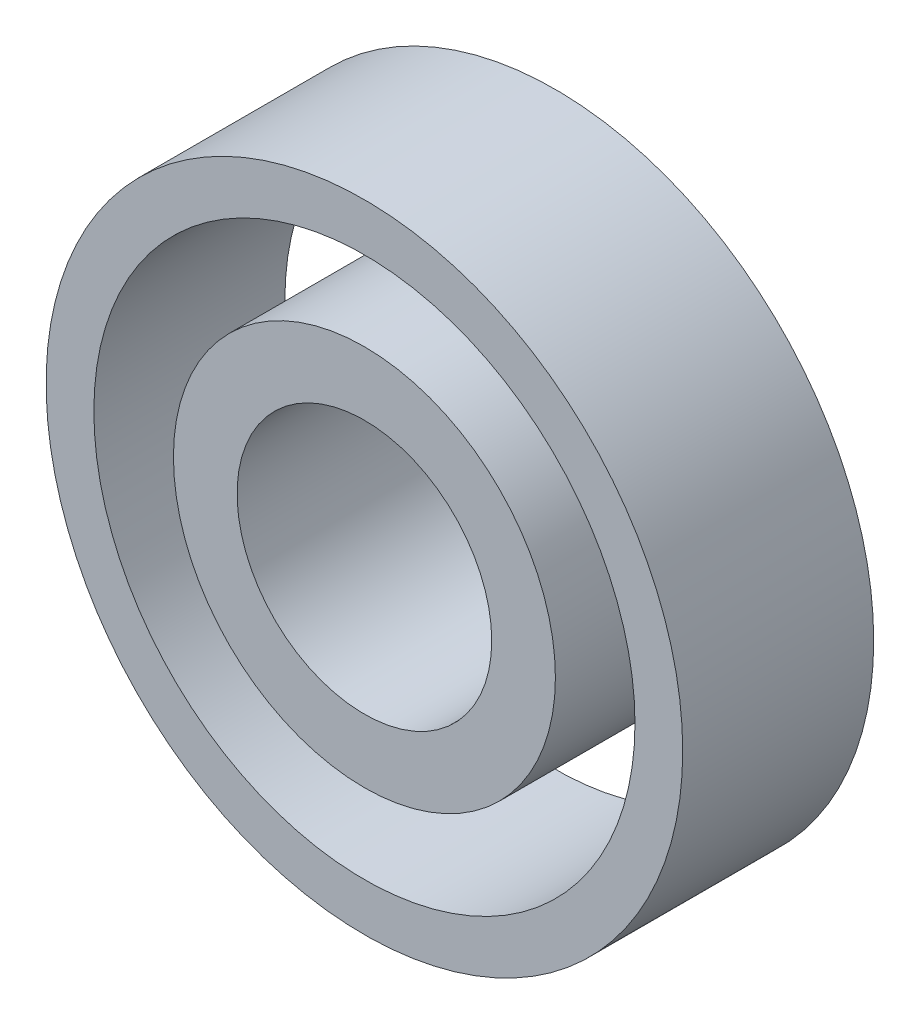
ISO-10303-21;
HEADER;
FILE_DESCRIPTION(('STEP AP214'),'2;1');
FILE_NAME('part.step','',(''),(''),'','','');
FILE_SCHEMA(('AUTOMOTIVE_DESIGN { 1 0 10303 214 1 1 1 1 }'));
ENDSEC;
DATA;
#1=APPLICATION_CONTEXT('core data for automotive mechanical design processes');
#2=APPLICATION_PROTOCOL_DEFINITION('international standard','automotive_design',2000,#1);
#3=PRODUCT_CONTEXT('',#1,'mechanical');
#4=PRODUCT('Part','Part','',(#3));
#5=PRODUCT_RELATED_PRODUCT_CATEGORY('part','',(#4));
#6=PRODUCT_DEFINITION_FORMATION('','',#4);
#7=PRODUCT_DEFINITION_CONTEXT('part definition',#1,'design');
#8=PRODUCT_DEFINITION('design','',#6,#7);
#9=PRODUCT_DEFINITION_SHAPE('','',#8);
#10=(LENGTH_UNIT() NAMED_UNIT(*) SI_UNIT(.MILLI.,.METRE.));
#11=(NAMED_UNIT(*) PLANE_ANGLE_UNIT() SI_UNIT($,.RADIAN.));
#12=(NAMED_UNIT(*) SI_UNIT($,.STERADIAN.) SOLID_ANGLE_UNIT());
#13=UNCERTAINTY_MEASURE_WITH_UNIT(LENGTH_MEASURE(1.E-05),#10,'distance_accuracy_value','');
#14=(GEOMETRIC_REPRESENTATION_CONTEXT(3) GLOBAL_UNCERTAINTY_ASSIGNED_CONTEXT((#13)) GLOBAL_UNIT_ASSIGNED_CONTEXT((#10,
#11,#12)) REPRESENTATION_CONTEXT('',''));
#15=CARTESIAN_POINT('',(0.,0.,0.));
#16=DIRECTION('',(0.,0.,1.));
#17=DIRECTION('',(1.,0.,0.));
#18=AXIS2_PLACEMENT_3D('',#15,#16,#17);
#19=CARTESIAN_POINT('',(0.,0.,-12.));
#20=DIRECTION('',(0.,0.,1.));
#21=DIRECTION('',(1.,0.,0.));
#22=AXIS2_PLACEMENT_3D('',#19,#20,#21);
#23=CYLINDRICAL_SURFACE('',#22,12.);
#24=CARTESIAN_POINT('',(0.,0.,-12.));
#25=DIRECTION('',(0.,0.,1.));
#26=DIRECTION('',(1.,0.,0.));
#27=AXIS2_PLACEMENT_3D('',#24,#25,#26);
#28=CIRCLE('',#27,12.);
#29=CARTESIAN_POINT('',(12.,0.,-12.));
#30=VERTEX_POINT('',#29);
#31=EDGE_CURVE('E11',#30,#30,#28,.T.);
#32=ORIENTED_EDGE('',*,*,#31,.T.);
#33=EDGE_LOOP('',(#32));
#34=FACE_BOUND('',#33,.T.);
#35=CARTESIAN_POINT('',(0.,0.,0.));
#36=DIRECTION('',(0.,0.,1.));
#37=DIRECTION('',(1.,0.,0.));
#38=AXIS2_PLACEMENT_3D('',#35,#36,#37);
#39=CIRCLE('',#38,12.);
#40=CARTESIAN_POINT('',(12.,0.,0.));
#41=VERTEX_POINT('',#40);
#42=EDGE_CURVE('E52',#41,#41,#39,.T.);
#43=ORIENTED_EDGE('',*,*,#42,.F.);
#44=EDGE_LOOP('',(#43));
#45=FACE_BOUND('',#44,.T.);
#46=ADVANCED_FACE('F49',(#34,#45),#23,.T.);
#47=CARTESIAN_POINT('',(0.,0.,-12.));
#48=DIRECTION('',(0.,0.,1.));
#49=DIRECTION('',(1.,0.,0.));
#50=AXIS2_PLACEMENT_3D('',#47,#48,#49);
#51=PLANE('',#50);
#52=CARTESIAN_POINT('',(0.,0.,-12.));
#53=DIRECTION('',(0.,0.,1.));
#54=DIRECTION('',(1.,0.,0.));
#55=AXIS2_PLACEMENT_3D('',#52,#53,#54);
#56=CIRCLE('',#55,8.);
#57=CARTESIAN_POINT('',(8.,0.,-12.));
#58=VERTEX_POINT('',#57);
#59=EDGE_CURVE('E59',#58,#58,#56,.T.);
#60=ORIENTED_EDGE('',*,*,#59,.T.);
#61=EDGE_LOOP('',(#60));
#62=FACE_BOUND('',#61,.T.);
#63=ORIENTED_EDGE('',*,*,#31,.F.);
#64=EDGE_LOOP('',(#63));
#65=FACE_BOUND('',#64,.T.);
#66=ADVANCED_FACE('F67',(#62,#65),#51,.F.);
#67=CARTESIAN_POINT('',(0.,0.,0.));
#68=DIRECTION('',(0.,0.,1.));
#69=DIRECTION('',(1.,0.,0.));
#70=AXIS2_PLACEMENT_3D('',#67,#68,#69);
#71=PLANE('',#70);
#72=CARTESIAN_POINT('',(0.,0.,0.));
#73=DIRECTION('',(0.,0.,1.));
#74=DIRECTION('',(1.,0.,0.));
#75=AXIS2_PLACEMENT_3D('',#72,#73,#74);
#76=CIRCLE('',#75,8.);
#77=CARTESIAN_POINT('',(8.,0.,0.));
#78=VERTEX_POINT('',#77);
#79=EDGE_CURVE('E61',#78,#78,#76,.T.);
#80=ORIENTED_EDGE('',*,*,#79,.F.);
#81=EDGE_LOOP('',(#80));
#82=FACE_BOUND('',#81,.T.);
#83=ORIENTED_EDGE('',*,*,#42,.T.);
#84=EDGE_LOOP('',(#83));
#85=FACE_BOUND('',#84,.T.);
#86=ADVANCED_FACE('F73',(#82,#85),#71,.T.);
#87=CARTESIAN_POINT('',(0.,0.,-12.));
#88=DIRECTION('',(0.,0.,1.));
#89=DIRECTION('',(1.,0.,0.));
#90=AXIS2_PLACEMENT_3D('',#87,#88,#89);
#91=CYLINDRICAL_SURFACE('',#90,8.);
#92=ORIENTED_EDGE('',*,*,#59,.F.);
#93=EDGE_LOOP('',(#92));
#94=FACE_BOUND('',#93,.T.);
#95=ORIENTED_EDGE('',*,*,#79,.T.);
#96=EDGE_LOOP('',(#95));
#97=FACE_BOUND('',#96,.T.);
#98=ADVANCED_FACE('F70',(#94,#97),#91,.F.);
#99=CLOSED_SHELL('',(#46,#66,#86,#98));
#100=MANIFOLD_SOLID_BREP('B2',#99);
#101=CARTESIAN_POINT('',(0.,0.,-12.));
#102=DIRECTION('',(0.,0.,1.));
#103=DIRECTION('',(1.,0.,0.));
#104=AXIS2_PLACEMENT_3D('',#101,#102,#103);
#105=CYLINDRICAL_SURFACE('',#104,20.);
#106=CARTESIAN_POINT('',(0.,0.,-12.));
#107=DIRECTION('',(0.,0.,1.));
#108=DIRECTION('',(1.,0.,0.));
#109=AXIS2_PLACEMENT_3D('',#106,#107,#108);
#110=CIRCLE('',#109,20.);
#111=CARTESIAN_POINT('',(20.,0.,-12.));
#112=VERTEX_POINT('',#111);
#113=EDGE_CURVE('E48',#112,#112,#110,.T.);
#114=ORIENTED_EDGE('',*,*,#113,.T.);
#115=EDGE_LOOP('',(#114));
#116=FACE_BOUND('',#115,.T.);
#117=CARTESIAN_POINT('',(0.,0.,0.));
#118=DIRECTION('',(0.,0.,1.));
#119=DIRECTION('',(1.,0.,0.));
#120=AXIS2_PLACEMENT_3D('',#117,#118,#119);
#121=CIRCLE('',#120,20.);
#122=CARTESIAN_POINT('',(20.,0.,0.));
#123=VERTEX_POINT('',#122);
#124=EDGE_CURVE('E114',#123,#123,#121,.T.);
#125=ORIENTED_EDGE('',*,*,#124,.F.);
#126=EDGE_LOOP('',(#125));
#127=FACE_BOUND('',#126,.T.);
#128=ADVANCED_FACE('F111',(#116,#127),#105,.T.);
#129=CARTESIAN_POINT('',(0.,0.,-12.));
#130=DIRECTION('',(0.,0.,1.));
#131=DIRECTION('',(1.,0.,0.));
#132=AXIS2_PLACEMENT_3D('',#129,#130,#131);
#133=PLANE('',#132);
#134=CARTESIAN_POINT('',(0.,0.,-12.));
#135=DIRECTION('',(0.,0.,1.));
#136=DIRECTION('',(1.,0.,0.));
#137=AXIS2_PLACEMENT_3D('',#134,#135,#136);
#138=CIRCLE('',#137,17.);
#139=CARTESIAN_POINT('',(17.,0.,-12.));
#140=VERTEX_POINT('',#139);
#141=EDGE_CURVE('E121',#140,#140,#138,.T.);
#142=ORIENTED_EDGE('',*,*,#141,.T.);
#143=EDGE_LOOP('',(#142));
#144=FACE_BOUND('',#143,.T.);
#145=ORIENTED_EDGE('',*,*,#113,.F.);
#146=EDGE_LOOP('',(#145));
#147=FACE_BOUND('',#146,.T.);
#148=ADVANCED_FACE('F129',(#144,#147),#133,.F.);
#149=CARTESIAN_POINT('',(0.,0.,0.));
#150=DIRECTION('',(0.,0.,1.));
#151=DIRECTION('',(1.,0.,0.));
#152=AXIS2_PLACEMENT_3D('',#149,#150,#151);
#153=PLANE('',#152);
#154=CARTESIAN_POINT('',(0.,0.,0.));
#155=DIRECTION('',(0.,0.,1.));
#156=DIRECTION('',(1.,0.,0.));
#157=AXIS2_PLACEMENT_3D('',#154,#155,#156);
#158=CIRCLE('',#157,17.);
#159=CARTESIAN_POINT('',(17.,0.,0.));
#160=VERTEX_POINT('',#159);
#161=EDGE_CURVE('E123',#160,#160,#158,.T.);
#162=ORIENTED_EDGE('',*,*,#161,.F.);
#163=EDGE_LOOP('',(#162));
#164=FACE_BOUND('',#163,.T.);
#165=ORIENTED_EDGE('',*,*,#124,.T.);
#166=EDGE_LOOP('',(#165));
#167=FACE_BOUND('',#166,.T.);
#168=ADVANCED_FACE('F135',(#164,#167),#153,.T.);
#169=CARTESIAN_POINT('',(0.,0.,-12.));
#170=DIRECTION('',(0.,0.,1.));
#171=DIRECTION('',(1.,0.,0.));
#172=AXIS2_PLACEMENT_3D('',#169,#170,#171);
#173=CYLINDRICAL_SURFACE('',#172,17.);
#174=ORIENTED_EDGE('',*,*,#141,.F.);
#175=EDGE_LOOP('',(#174));
#176=FACE_BOUND('',#175,.T.);
#177=ORIENTED_EDGE('',*,*,#161,.T.);
#178=EDGE_LOOP('',(#177));
#179=FACE_BOUND('',#178,.T.);
#180=ADVANCED_FACE('F132',(#176,#179),#173,.F.);
#181=CLOSED_SHELL('',(#128,#148,#168,#180));
#182=MANIFOLD_SOLID_BREP('B6',#181);
#183=ADVANCED_BREP_SHAPE_REPRESENTATION('',(#18,#100,#182),#14);
#184=SHAPE_DEFINITION_REPRESENTATION(#9,#183);
ENDSEC;
END-ISO-10303-21;
